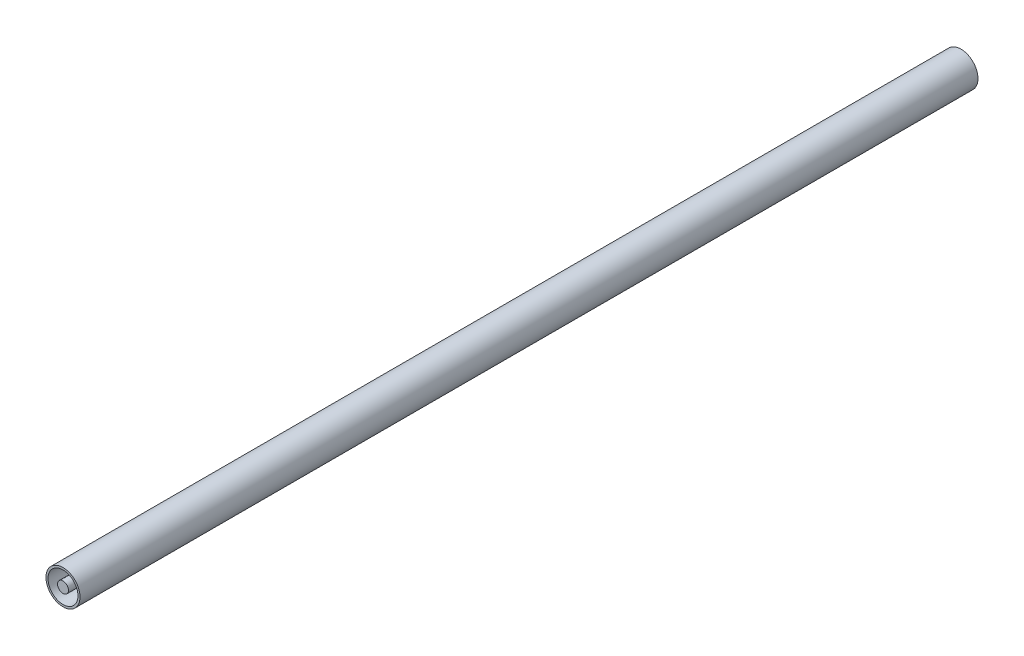
ISO-10303-21;
HEADER;
FILE_DESCRIPTION(('STEP AP214'),'2;1');
FILE_NAME('part.step','',(''),(''),'','','');
FILE_SCHEMA(('AUTOMOTIVE_DESIGN { 1 0 10303 214 1 1 1 1 }'));
ENDSEC;
DATA;
#1=APPLICATION_CONTEXT('core data for automotive mechanical design processes');
#2=APPLICATION_PROTOCOL_DEFINITION('international standard','automotive_design',2000,#1);
#3=PRODUCT_CONTEXT('',#1,'mechanical');
#4=PRODUCT('Part','Part','',(#3));
#5=PRODUCT_RELATED_PRODUCT_CATEGORY('part','',(#4));
#6=PRODUCT_DEFINITION_FORMATION('','',#4);
#7=PRODUCT_DEFINITION_CONTEXT('part definition',#1,'design');
#8=PRODUCT_DEFINITION('design','',#6,#7);
#9=PRODUCT_DEFINITION_SHAPE('','',#8);
#10=(LENGTH_UNIT() NAMED_UNIT(*) SI_UNIT(.MILLI.,.METRE.));
#11=(NAMED_UNIT(*) PLANE_ANGLE_UNIT() SI_UNIT($,.RADIAN.));
#12=(NAMED_UNIT(*) SI_UNIT($,.STERADIAN.) SOLID_ANGLE_UNIT());
#13=UNCERTAINTY_MEASURE_WITH_UNIT(LENGTH_MEASURE(1.E-05),#10,'distance_accuracy_value','');
#14=(GEOMETRIC_REPRESENTATION_CONTEXT(3) GLOBAL_UNCERTAINTY_ASSIGNED_CONTEXT((#13)) GLOBAL_UNIT_ASSIGNED_CONTEXT((#10,
#11,#12)) REPRESENTATION_CONTEXT('',''));
#15=CARTESIAN_POINT('',(0.,0.,0.));
#16=DIRECTION('',(0.,0.,1.));
#17=DIRECTION('',(1.,0.,0.));
#18=AXIS2_PLACEMENT_3D('',#15,#16,#17);
#19=CARTESIAN_POINT('',(240.,0.,309.));
#20=DIRECTION('',(0.,0.,-1.));
#21=DIRECTION('',(-1.,0.,0.));
#22=AXIS2_PLACEMENT_3D('',#19,#20,#21);
#23=CYLINDRICAL_SURFACE('',#22,4.);
#24=CARTESIAN_POINT('',(240.,0.,309.));
#25=DIRECTION('',(0.,0.,1.));
#26=DIRECTION('',(1.,0.,0.));
#27=AXIS2_PLACEMENT_3D('',#24,#25,#26);
#28=CIRCLE('',#27,4.);
#29=CARTESIAN_POINT('',(244.,0.,309.));
#30=VERTEX_POINT('',#29);
#31=EDGE_CURVE('E11',#30,#30,#28,.T.);
#32=ORIENTED_EDGE('',*,*,#31,.F.);
#33=EDGE_LOOP('',(#32));
#34=FACE_BOUND('',#33,.T.);
#35=CARTESIAN_POINT('',(240.,0.,-351.));
#36=DIRECTION('',(0.,0.,1.));
#37=DIRECTION('',(1.,0.,0.));
#38=AXIS2_PLACEMENT_3D('',#35,#36,#37);
#39=CIRCLE('',#38,4.);
#40=CARTESIAN_POINT('',(244.,0.,-351.));
#41=VERTEX_POINT('',#40);
#42=EDGE_CURVE('E48',#41,#41,#39,.T.);
#43=ORIENTED_EDGE('',*,*,#42,.T.);
#44=EDGE_LOOP('',(#43));
#45=FACE_BOUND('',#44,.T.);
#46=ADVANCED_FACE('F44',(#34,#45),#23,.T.);
#47=CARTESIAN_POINT('',(240.,0.,309.));
#48=DIRECTION('',(0.,0.,1.));
#49=DIRECTION('',(1.,0.,0.));
#50=AXIS2_PLACEMENT_3D('',#47,#48,#49);
#51=PLANE('',#50);
#52=ORIENTED_EDGE('',*,*,#31,.T.);
#53=EDGE_LOOP('',(#52));
#54=FACE_BOUND('',#53,.T.);
#55=ADVANCED_FACE('F58',(#54),#51,.T.);
#56=CARTESIAN_POINT('',(240.,0.,-351.));
#57=DIRECTION('',(0.,0.,1.));
#58=DIRECTION('',(1.,0.,0.));
#59=AXIS2_PLACEMENT_3D('',#56,#57,#58);
#60=PLANE('',#59);
#61=ORIENTED_EDGE('',*,*,#42,.F.);
#62=EDGE_LOOP('',(#61));
#63=FACE_BOUND('',#62,.T.);
#64=ADVANCED_FACE('F59',(#63),#60,.F.);
#65=CLOSED_SHELL('',(#46,#55,#64));
#66=MANIFOLD_SOLID_BREP('B2',#65);
#67=CARTESIAN_POINT('',(240.,0.,309.));
#68=DIRECTION('',(0.,0.,1.));
#69=DIRECTION('',(1.,0.,0.));
#70=AXIS2_PLACEMENT_3D('',#67,#68,#69);
#71=PLANE('',#70);
#72=CARTESIAN_POINT('',(240.,0.,309.));
#73=DIRECTION('',(0.,0.,1.));
#74=DIRECTION('',(1.,0.,0.));
#75=AXIS2_PLACEMENT_3D('',#72,#73,#74);
#76=CIRCLE('',#75,12.5);
#77=CARTESIAN_POINT('',(252.5,0.,309.));
#78=VERTEX_POINT('',#77);
#79=EDGE_CURVE('E42',#78,#78,#76,.T.);
#80=ORIENTED_EDGE('',*,*,#79,.T.);
#81=EDGE_LOOP('',(#80));
#82=FACE_BOUND('',#81,.T.);
#83=CARTESIAN_POINT('',(240.,0.,309.));
#84=DIRECTION('',(0.,0.,1.));
#85=DIRECTION('',(1.,0.,0.));
#86=AXIS2_PLACEMENT_3D('',#83,#84,#85);
#87=CIRCLE('',#86,11.);
#88=CARTESIAN_POINT('',(251.,0.,309.));
#89=VERTEX_POINT('',#88);
#90=EDGE_CURVE('E100',#89,#89,#87,.T.);
#91=ORIENTED_EDGE('',*,*,#90,.F.);
#92=EDGE_LOOP('',(#91));
#93=FACE_BOUND('',#92,.T.);
#94=ADVANCED_FACE('F88',(#82,#93),#71,.T.);
#95=CARTESIAN_POINT('',(240.,0.,-350.));
#96=DIRECTION('',(0.,0.,1.));
#97=DIRECTION('',(1.,0.,0.));
#98=AXIS2_PLACEMENT_3D('',#95,#96,#97);
#99=PLANE('',#98);
#100=CARTESIAN_POINT('',(240.,0.,-350.));
#101=DIRECTION('',(0.,0.,1.));
#102=DIRECTION('',(1.,0.,0.));
#103=AXIS2_PLACEMENT_3D('',#100,#101,#102);
#104=CIRCLE('',#103,12.5);
#105=CARTESIAN_POINT('',(252.5,0.,-350.));
#106=VERTEX_POINT('',#105);
#107=EDGE_CURVE('E89',#106,#106,#104,.T.);
#108=ORIENTED_EDGE('',*,*,#107,.F.);
#109=EDGE_LOOP('',(#108));
#110=FACE_BOUND('',#109,.T.);
#111=CARTESIAN_POINT('',(240.,0.,-350.));
#112=DIRECTION('',(0.,0.,1.));
#113=DIRECTION('',(1.,0.,0.));
#114=AXIS2_PLACEMENT_3D('',#111,#112,#113);
#115=CIRCLE('',#114,11.);
#116=CARTESIAN_POINT('',(251.,0.,-350.));
#117=VERTEX_POINT('',#116);
#118=EDGE_CURVE('E97',#117,#117,#115,.T.);
#119=ORIENTED_EDGE('',*,*,#118,.T.);
#120=EDGE_LOOP('',(#119));
#121=FACE_BOUND('',#120,.T.);
#122=ADVANCED_FACE('F108',(#110,#121),#99,.F.);
#123=CARTESIAN_POINT('',(240.,0.,309.));
#124=DIRECTION('',(0.,0.,-1.));
#125=DIRECTION('',(-1.,0.,0.));
#126=AXIS2_PLACEMENT_3D('',#123,#124,#125);
#127=CYLINDRICAL_SURFACE('',#126,12.5);
#128=ORIENTED_EDGE('',*,*,#79,.F.);
#129=EDGE_LOOP('',(#128));
#130=FACE_BOUND('',#129,.T.);
#131=ORIENTED_EDGE('',*,*,#107,.T.);
#132=EDGE_LOOP('',(#131));
#133=FACE_BOUND('',#132,.T.);
#134=ADVANCED_FACE('F86',(#130,#133),#127,.T.);
#135=CARTESIAN_POINT('',(240.,0.,309.));
#136=DIRECTION('',(0.,0.,-1.));
#137=DIRECTION('',(-1.,0.,0.));
#138=AXIS2_PLACEMENT_3D('',#135,#136,#137);
#139=CYLINDRICAL_SURFACE('',#138,11.);
#140=ORIENTED_EDGE('',*,*,#90,.T.);
#141=EDGE_LOOP('',(#140));
#142=FACE_BOUND('',#141,.T.);
#143=ORIENTED_EDGE('',*,*,#118,.F.);
#144=EDGE_LOOP('',(#143));
#145=FACE_BOUND('',#144,.T.);
#146=ADVANCED_FACE('F104',(#142,#145),#139,.F.);
#147=CLOSED_SHELL('',(#94,#122,#134,#146));
#148=MANIFOLD_SOLID_BREP('B6',#147);
#149=ADVANCED_BREP_SHAPE_REPRESENTATION('',(#18,#66,#148),#14);
#150=SHAPE_DEFINITION_REPRESENTATION(#9,#149);
ENDSEC;
END-ISO-10303-21;
